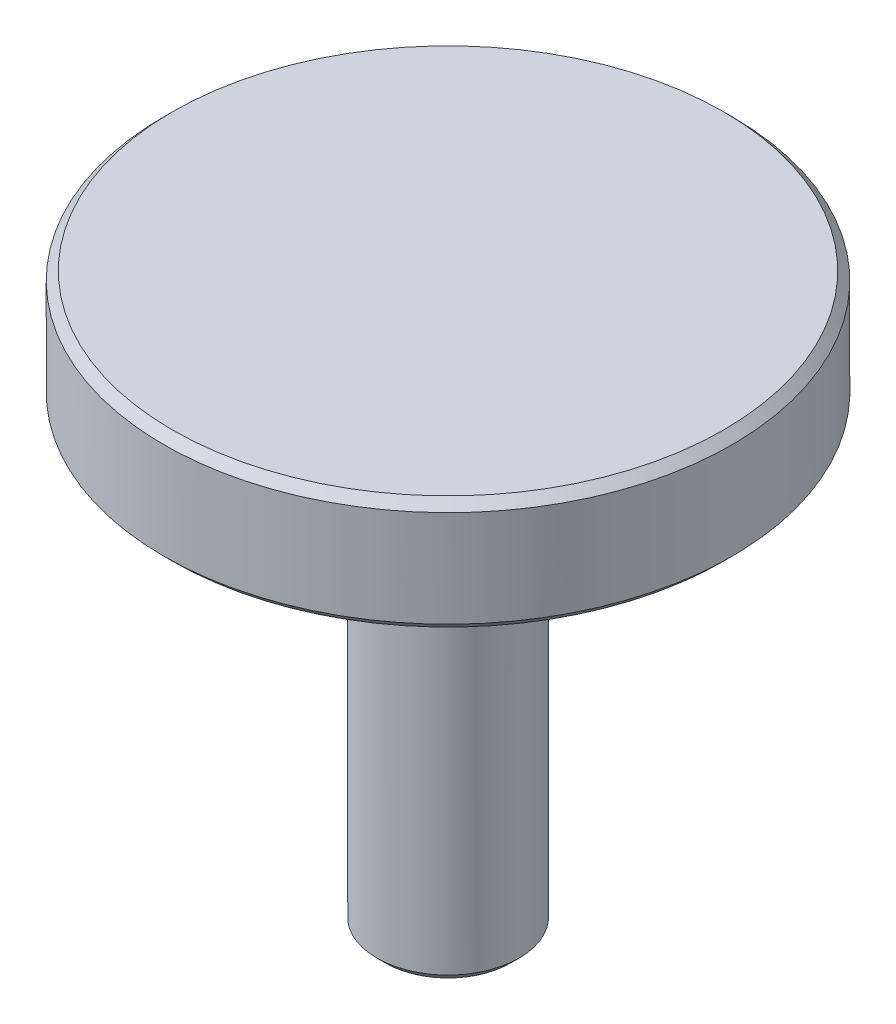
ISO-10303-21;
HEADER;
FILE_DESCRIPTION(('STEP AP214'),'2;1');
FILE_NAME('part.step','',(''),(''),'','','');
FILE_SCHEMA(('AUTOMOTIVE_DESIGN { 1 0 10303 214 1 1 1 1 }'));
ENDSEC;
DATA;
#1=APPLICATION_CONTEXT('core data for automotive mechanical design processes');
#2=APPLICATION_PROTOCOL_DEFINITION('international standard','automotive_design',2000,#1);
#3=PRODUCT_CONTEXT('',#1,'mechanical');
#4=PRODUCT('Part','Part','',(#3));
#5=PRODUCT_RELATED_PRODUCT_CATEGORY('part','',(#4));
#6=PRODUCT_DEFINITION_FORMATION('','',#4);
#7=PRODUCT_DEFINITION_CONTEXT('part definition',#1,'design');
#8=PRODUCT_DEFINITION('design','',#6,#7);
#9=PRODUCT_DEFINITION_SHAPE('','',#8);
#10=(LENGTH_UNIT() NAMED_UNIT(*) SI_UNIT(.MILLI.,.METRE.));
#11=(NAMED_UNIT(*) PLANE_ANGLE_UNIT() SI_UNIT($,.RADIAN.));
#12=(NAMED_UNIT(*) SI_UNIT($,.STERADIAN.) SOLID_ANGLE_UNIT());
#13=UNCERTAINTY_MEASURE_WITH_UNIT(LENGTH_MEASURE(1.E-05),#10,'distance_accuracy_value','');
#14=(GEOMETRIC_REPRESENTATION_CONTEXT(3) GLOBAL_UNCERTAINTY_ASSIGNED_CONTEXT((#13)) GLOBAL_UNIT_ASSIGNED_CONTEXT((#10,
#11,#12)) REPRESENTATION_CONTEXT('',''));
#15=CARTESIAN_POINT('',(0.,0.,0.));
#16=DIRECTION('',(0.,0.,1.));
#17=DIRECTION('',(1.,0.,0.));
#18=AXIS2_PLACEMENT_3D('',#15,#16,#17);
#19=CARTESIAN_POINT('',(2.5,0.,0.));
#20=DIRECTION('',(0.,-1.,0.));
#21=DIRECTION('',(0.,0.,-1.));
#22=AXIS2_PLACEMENT_3D('',#19,#20,#21);
#23=PLANE('',#22);
#24=CARTESIAN_POINT('',(0.,0.,0.));
#25=DIRECTION('',(0.,1.,0.));
#26=DIRECTION('',(0.,0.,1.));
#27=AXIS2_PLACEMENT_3D('',#24,#25,#26);
#28=CIRCLE('',#27,2.20000000001619);
#29=CARTESIAN_POINT('',(0.,0.,2.20000000001619));
#30=VERTEX_POINT('',#29);
#31=EDGE_CURVE('E17',#30,#30,#28,.T.);
#32=ORIENTED_EDGE('',*,*,#31,.F.);
#33=EDGE_LOOP('',(#32));
#34=FACE_BOUND('',#33,.T.);
#35=ADVANCED_FACE('F14',(#34),#23,.T.);
#36=CARTESIAN_POINT('',(0.,0.299999999981537,0.));
#37=DIRECTION('',(0.,1.,0.));
#38=DIRECTION('',(0.,0.,1.));
#39=AXIS2_PLACEMENT_3D('',#36,#37,#38);
#40=CONICAL_SURFACE('',#39,2.49999999999773,0.785398163397448);
#41=ORIENTED_EDGE('',*,*,#31,.T.);
#42=EDGE_LOOP('',(#41));
#43=FACE_BOUND('',#42,.T.);
#44=CARTESIAN_POINT('',(0.,0.299999999999995,0.));
#45=DIRECTION('',(0.,-1.,0.));
#46=DIRECTION('',(0.,0.,-1.));
#47=AXIS2_PLACEMENT_3D('',#44,#45,#46);
#48=CIRCLE('',#47,2.5);
#49=CARTESIAN_POINT('',(0.,0.299999999999995,-2.5));
#50=VERTEX_POINT('',#49);
#51=EDGE_CURVE('E30',#50,#50,#48,.F.);
#52=ORIENTED_EDGE('',*,*,#51,.F.);
#53=EDGE_LOOP('',(#52));
#54=FACE_BOUND('',#53,.T.);
#55=ADVANCED_FACE('F44',(#43,#54),#40,.T.);
#56=CARTESIAN_POINT('',(0.,0.,0.));
#57=DIRECTION('',(0.,-1.,0.));
#58=DIRECTION('',(0.,0.,-1.));
#59=AXIS2_PLACEMENT_3D('',#56,#57,#58);
#60=CYLINDRICAL_SURFACE('',#59,2.5);
#61=CARTESIAN_POINT('',(0.,16.,0.));
#62=DIRECTION('',(0.,-1.,0.));
#63=DIRECTION('',(0.,0.,-1.));
#64=AXIS2_PLACEMENT_3D('',#61,#62,#63);
#65=CIRCLE('',#64,2.5);
#66=CARTESIAN_POINT('',(0.,16.,-2.5));
#67=VERTEX_POINT('',#66);
#68=EDGE_CURVE('E34',#67,#67,#65,.F.);
#69=ORIENTED_EDGE('',*,*,#68,.F.);
#70=EDGE_LOOP('',(#69));
#71=FACE_BOUND('',#70,.T.);
#72=ORIENTED_EDGE('',*,*,#51,.T.);
#73=EDGE_LOOP('',(#72));
#74=FACE_BOUND('',#73,.T.);
#75=ADVANCED_FACE('F52',(#71,#74),#60,.T.);
#76=CARTESIAN_POINT('',(10.,16.,0.));
#77=DIRECTION('',(0.,-1.,0.));
#78=DIRECTION('',(0.,0.,-1.));
#79=AXIS2_PLACEMENT_3D('',#76,#77,#78);
#80=PLANE('',#79);
#81=ORIENTED_EDGE('',*,*,#68,.T.);
#82=EDGE_LOOP('',(#81));
#83=FACE_BOUND('',#82,.T.);
#84=CARTESIAN_POINT('',(0.,16.,0.));
#85=DIRECTION('',(0.,1.,0.));
#86=DIRECTION('',(0.,0.,1.));
#87=AXIS2_PLACEMENT_3D('',#84,#85,#86);
#88=CIRCLE('',#87,9.69999999999999);
#89=CARTESIAN_POINT('',(0.,16.,9.69999999999999));
#90=VERTEX_POINT('',#89);
#91=EDGE_CURVE('E32',#90,#90,#88,.T.);
#92=ORIENTED_EDGE('',*,*,#91,.F.);
#93=EDGE_LOOP('',(#92));
#94=FACE_BOUND('',#93,.T.);
#95=ADVANCED_FACE('F70',(#83,#94),#80,.T.);
#96=CARTESIAN_POINT('',(0.,16.3,0.));
#97=DIRECTION('',(0.,1.,0.));
#98=DIRECTION('',(0.,0.,1.));
#99=AXIS2_PLACEMENT_3D('',#96,#97,#98);
#100=CONICAL_SURFACE('',#99,10.,0.785398163397448);
#101=CARTESIAN_POINT('',(0.,16.3,0.));
#102=DIRECTION('',(0.,-1.,0.));
#103=DIRECTION('',(0.,0.,-1.));
#104=AXIS2_PLACEMENT_3D('',#101,#102,#103);
#105=CIRCLE('',#104,10.);
#106=CARTESIAN_POINT('',(0.,16.3,-10.));
#107=VERTEX_POINT('',#106);
#108=EDGE_CURVE('E26',#107,#107,#105,.F.);
#109=ORIENTED_EDGE('',*,*,#108,.F.);
#110=EDGE_LOOP('',(#109));
#111=FACE_BOUND('',#110,.T.);
#112=ORIENTED_EDGE('',*,*,#91,.T.);
#113=EDGE_LOOP('',(#112));
#114=FACE_BOUND('',#113,.T.);
#115=ADVANCED_FACE('F66',(#111,#114),#100,.T.);
#116=CARTESIAN_POINT('',(0.,0.,0.));
#117=DIRECTION('',(0.,-1.,0.));
#118=DIRECTION('',(0.,0.,-1.));
#119=AXIS2_PLACEMENT_3D('',#116,#117,#118);
#120=CYLINDRICAL_SURFACE('',#119,10.);
#121=ORIENTED_EDGE('',*,*,#108,.T.);
#122=EDGE_LOOP('',(#121));
#123=FACE_BOUND('',#122,.T.);
#124=CARTESIAN_POINT('',(0.,19.7,0.));
#125=DIRECTION('',(0.,-1.,0.));
#126=DIRECTION('',(0.,0.,-1.));
#127=AXIS2_PLACEMENT_3D('',#124,#125,#126);
#128=CIRCLE('',#127,10.);
#129=CARTESIAN_POINT('',(0.,19.7,-10.));
#130=VERTEX_POINT('',#129);
#131=EDGE_CURVE('E21',#130,#130,#128,.F.);
#132=ORIENTED_EDGE('',*,*,#131,.F.);
#133=EDGE_LOOP('',(#132));
#134=FACE_BOUND('',#133,.T.);
#135=ADVANCED_FACE('F60',(#123,#134),#120,.T.);
#136=CARTESIAN_POINT('',(0.,19.7,0.));
#137=DIRECTION('',(0.,-1.,0.));
#138=DIRECTION('',(0.,0.,-1.));
#139=AXIS2_PLACEMENT_3D('',#136,#137,#138);
#140=CONICAL_SURFACE('',#139,10.,0.785398163397445);
#141=ORIENTED_EDGE('',*,*,#131,.T.);
#142=EDGE_LOOP('',(#141));
#143=FACE_BOUND('',#142,.T.);
#144=CARTESIAN_POINT('',(0.,20.,0.));
#145=DIRECTION('',(0.,-1.,0.));
#146=DIRECTION('',(0.,0.,-1.));
#147=AXIS2_PLACEMENT_3D('',#144,#145,#146);
#148=CIRCLE('',#147,9.7);
#149=CARTESIAN_POINT('',(0.,20.,-9.7));
#150=VERTEX_POINT('',#149);
#151=EDGE_CURVE('E10',#150,#150,#148,.F.);
#152=ORIENTED_EDGE('',*,*,#151,.F.);
#153=EDGE_LOOP('',(#152));
#154=FACE_BOUND('',#153,.T.);
#155=ADVANCED_FACE('F55',(#143,#154),#140,.T.);
#156=CARTESIAN_POINT('',(0.,20.,0.));
#157=DIRECTION('',(0.,1.,0.));
#158=DIRECTION('',(0.,0.,1.));
#159=AXIS2_PLACEMENT_3D('',#156,#157,#158);
#160=PLANE('',#159);
#161=ORIENTED_EDGE('',*,*,#151,.T.);
#162=EDGE_LOOP('',(#161));
#163=FACE_BOUND('',#162,.T.);
#164=ADVANCED_FACE('F53',(#163),#160,.T.);
#165=CLOSED_SHELL('',(#35,#55,#75,#95,#115,#135,#155,#164));
#166=MANIFOLD_SOLID_BREP('B1',#165);
#167=ADVANCED_BREP_SHAPE_REPRESENTATION('',(#18,#166),#14);
#168=SHAPE_DEFINITION_REPRESENTATION(#9,#167);
ENDSEC;
END-ISO-10303-21;
